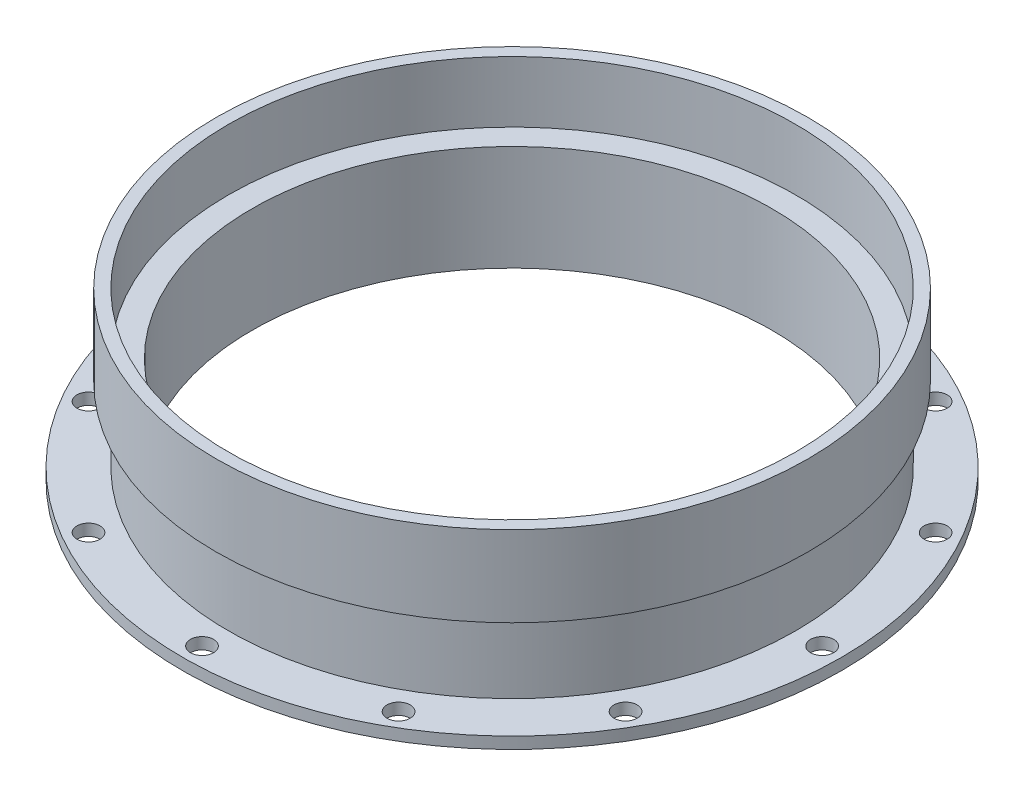
ISO-10303-21;
HEADER;
FILE_DESCRIPTION(('STEP AP214'),'2;1');
FILE_NAME('part.step','',(''),(''),'','','');
FILE_SCHEMA(('AUTOMOTIVE_DESIGN { 1 0 10303 214 1 1 1 1 }'));
ENDSEC;
DATA;
#1=APPLICATION_CONTEXT('core data for automotive mechanical design processes');
#2=APPLICATION_PROTOCOL_DEFINITION('international standard','automotive_design',2000,#1);
#3=PRODUCT_CONTEXT('',#1,'mechanical');
#4=PRODUCT('Part','Part','',(#3));
#5=PRODUCT_RELATED_PRODUCT_CATEGORY('part','',(#4));
#6=PRODUCT_DEFINITION_FORMATION('','',#4);
#7=PRODUCT_DEFINITION_CONTEXT('part definition',#1,'design');
#8=PRODUCT_DEFINITION('design','',#6,#7);
#9=PRODUCT_DEFINITION_SHAPE('','',#8);
#10=(LENGTH_UNIT() NAMED_UNIT(*) SI_UNIT(.MILLI.,.METRE.));
#11=(NAMED_UNIT(*) PLANE_ANGLE_UNIT() SI_UNIT($,.RADIAN.));
#12=(NAMED_UNIT(*) SI_UNIT($,.STERADIAN.) SOLID_ANGLE_UNIT());
#13=UNCERTAINTY_MEASURE_WITH_UNIT(LENGTH_MEASURE(1.E-05),#10,'distance_accuracy_value','');
#14=(GEOMETRIC_REPRESENTATION_CONTEXT(3) GLOBAL_UNCERTAINTY_ASSIGNED_CONTEXT((#13)) GLOBAL_UNIT_ASSIGNED_CONTEXT((#10,
#11,#12)) REPRESENTATION_CONTEXT('',''));
#15=CARTESIAN_POINT('',(0.,0.,0.));
#16=DIRECTION('',(0.,0.,1.));
#17=DIRECTION('',(1.,0.,0.));
#18=AXIS2_PLACEMENT_3D('',#15,#16,#17);
#19=CARTESIAN_POINT('',(0.,17.8,0.));
#20=DIRECTION('',(0.,-1.,0.));
#21=DIRECTION('',(-1.,0.,0.));
#22=AXIS2_PLACEMENT_3D('',#19,#20,#21);
#23=CYLINDRICAL_SURFACE('',#22,53.85);
#24=CARTESIAN_POINT('',(0.,0.,0.));
#25=DIRECTION('',(0.,1.,0.));
#26=DIRECTION('',(1.,0.,0.));
#27=AXIS2_PLACEMENT_3D('',#24,#25,#26);
#28=CIRCLE('',#27,53.85);
#29=CARTESIAN_POINT('',(53.85,0.,0.));
#30=VERTEX_POINT('',#29);
#31=EDGE_CURVE('E10',#30,#30,#28,.T.);
#32=ORIENTED_EDGE('',*,*,#31,.T.);
#33=EDGE_LOOP('',(#32));
#34=FACE_BOUND('',#33,.T.);
#35=CARTESIAN_POINT('',(0.,14.1,0.));
#36=DIRECTION('',(0.,1.,0.));
#37=DIRECTION('',(1.,0.,0.));
#38=AXIS2_PLACEMENT_3D('',#35,#36,#37);
#39=CIRCLE('',#38,53.85);
#40=CARTESIAN_POINT('',(53.85,14.1,0.));
#41=VERTEX_POINT('',#40);
#42=EDGE_CURVE('E21',#41,#41,#39,.T.);
#43=ORIENTED_EDGE('',*,*,#42,.F.);
#44=EDGE_LOOP('',(#43));
#45=FACE_BOUND('',#44,.T.);
#46=ADVANCED_FACE('F15',(#34,#45),#23,.T.);
#47=CARTESIAN_POINT('',(0.,-2.2,0.));
#48=DIRECTION('',(0.,1.,0.));
#49=DIRECTION('',(1.,0.,0.));
#50=AXIS2_PLACEMENT_3D('',#47,#48,#49);
#51=CYLINDRICAL_SURFACE('',#50,62.55);
#52=CARTESIAN_POINT('',(0.,-2.2,0.));
#53=DIRECTION('',(0.,1.,0.));
#54=DIRECTION('',(1.,0.,0.));
#55=AXIS2_PLACEMENT_3D('',#52,#53,#54);
#56=CIRCLE('',#55,62.55);
#57=CARTESIAN_POINT('',(62.55,-2.2,0.));
#58=VERTEX_POINT('',#57);
#59=EDGE_CURVE('E25',#58,#58,#56,.T.);
#60=ORIENTED_EDGE('',*,*,#59,.T.);
#61=EDGE_LOOP('',(#60));
#62=FACE_BOUND('',#61,.T.);
#63=CARTESIAN_POINT('',(0.,0.,0.));
#64=DIRECTION('',(0.,1.,0.));
#65=DIRECTION('',(1.,0.,0.));
#66=AXIS2_PLACEMENT_3D('',#63,#64,#65);
#67=CIRCLE('',#66,62.55);
#68=CARTESIAN_POINT('',(62.55,0.,0.));
#69=VERTEX_POINT('',#68);
#70=EDGE_CURVE('E29',#69,#69,#67,.T.);
#71=ORIENTED_EDGE('',*,*,#70,.F.);
#72=EDGE_LOOP('',(#71));
#73=FACE_BOUND('',#72,.T.);
#74=ADVANCED_FACE('F143',(#62,#73),#51,.T.);
#75=CARTESIAN_POINT('',(0.,-2.2,0.));
#76=DIRECTION('',(0.,1.,0.));
#77=DIRECTION('',(1.,0.,0.));
#78=AXIS2_PLACEMENT_3D('',#75,#76,#77);
#79=CYLINDRICAL_SURFACE('',#78,49.35);
#80=CARTESIAN_POINT('',(0.,-2.2,0.));
#81=DIRECTION('',(0.,1.,0.));
#82=DIRECTION('',(1.,0.,0.));
#83=AXIS2_PLACEMENT_3D('',#80,#81,#82);
#84=CIRCLE('',#83,49.35);
#85=CARTESIAN_POINT('',(49.35,-2.2,0.));
#86=VERTEX_POINT('',#85);
#87=EDGE_CURVE('E34',#86,#86,#84,.T.);
#88=ORIENTED_EDGE('',*,*,#87,.F.);
#89=EDGE_LOOP('',(#88));
#90=FACE_BOUND('',#89,.T.);
#91=CARTESIAN_POINT('',(0.,17.8,0.));
#92=DIRECTION('',(0.,1.,0.));
#93=DIRECTION('',(1.,0.,0.));
#94=AXIS2_PLACEMENT_3D('',#91,#92,#93);
#95=CIRCLE('',#94,49.35);
#96=CARTESIAN_POINT('',(49.35,17.8,0.));
#97=VERTEX_POINT('',#96);
#98=EDGE_CURVE('E37',#97,#97,#95,.T.);
#99=ORIENTED_EDGE('',*,*,#98,.T.);
#100=EDGE_LOOP('',(#99));
#101=FACE_BOUND('',#100,.T.);
#102=ADVANCED_FACE('F147',(#90,#101),#79,.F.);
#103=CARTESIAN_POINT('',(0.,-2.2,0.));
#104=DIRECTION('',(0.,1.,0.));
#105=DIRECTION('',(1.,0.,0.));
#106=AXIS2_PLACEMENT_3D('',#103,#104,#105);
#107=PLANE('',#106);
#108=CARTESIAN_POINT('',(29.425,-2.2,-50.9655950127142));
#109=DIRECTION('',(0.,-1.,0.));
#110=DIRECTION('',(-1.,0.,0.));
#111=AXIS2_PLACEMENT_3D('',#108,#109,#110);
#112=CIRCLE('',#111,2.2);
#113=CARTESIAN_POINT('',(27.225,-2.2,-50.9655950127142));
#114=VERTEX_POINT('',#113);
#115=EDGE_CURVE('E40',#114,#114,#112,.T.);
#116=ORIENTED_EDGE('',*,*,#115,.F.);
#117=EDGE_LOOP('',(#116));
#118=FACE_BOUND('',#117,.T.);
#119=CARTESIAN_POINT('',(0.,-2.2,-58.85));
#120=DIRECTION('',(0.,-1.,0.));
#121=DIRECTION('',(-1.,0.,0.));
#122=AXIS2_PLACEMENT_3D('',#119,#120,#121);
#123=CIRCLE('',#122,2.2);
#124=CARTESIAN_POINT('',(-2.2,-2.2,-58.85));
#125=VERTEX_POINT('',#124);
#126=EDGE_CURVE('E43',#125,#125,#123,.T.);
#127=ORIENTED_EDGE('',*,*,#126,.F.);
#128=EDGE_LOOP('',(#127));
#129=FACE_BOUND('',#128,.T.);
#130=CARTESIAN_POINT('',(-29.425,-2.2,-50.9655950127142));
#131=DIRECTION('',(0.,-1.,0.));
#132=DIRECTION('',(-1.,0.,0.));
#133=AXIS2_PLACEMENT_3D('',#130,#131,#132);
#134=CIRCLE('',#133,2.2);
#135=CARTESIAN_POINT('',(-31.625,-2.2,-50.9655950127142));
#136=VERTEX_POINT('',#135);
#137=EDGE_CURVE('E46',#136,#136,#134,.T.);
#138=ORIENTED_EDGE('',*,*,#137,.F.);
#139=EDGE_LOOP('',(#138));
#140=FACE_BOUND('',#139,.T.);
#141=CARTESIAN_POINT('',(-50.9655950127142,-2.2,-29.425));
#142=DIRECTION('',(0.,-1.,0.));
#143=DIRECTION('',(-1.,0.,0.));
#144=AXIS2_PLACEMENT_3D('',#141,#142,#143);
#145=CIRCLE('',#144,2.2);
#146=CARTESIAN_POINT('',(-53.1655950127142,-2.2,-29.425));
#147=VERTEX_POINT('',#146);
#148=EDGE_CURVE('E49',#147,#147,#145,.T.);
#149=ORIENTED_EDGE('',*,*,#148,.F.);
#150=EDGE_LOOP('',(#149));
#151=FACE_BOUND('',#150,.T.);
#152=CARTESIAN_POINT('',(-58.85,-2.2,0.));
#153=DIRECTION('',(0.,-1.,0.));
#154=DIRECTION('',(-1.,0.,0.));
#155=AXIS2_PLACEMENT_3D('',#152,#153,#154);
#156=CIRCLE('',#155,2.2);
#157=CARTESIAN_POINT('',(-61.05,-2.2,0.));
#158=VERTEX_POINT('',#157);
#159=EDGE_CURVE('E52',#158,#158,#156,.T.);
#160=ORIENTED_EDGE('',*,*,#159,.F.);
#161=EDGE_LOOP('',(#160));
#162=FACE_BOUND('',#161,.T.);
#163=CARTESIAN_POINT('',(-50.9655950127142,-2.2,29.425));
#164=DIRECTION('',(0.,-1.,0.));
#165=DIRECTION('',(-1.,0.,0.));
#166=AXIS2_PLACEMENT_3D('',#163,#164,#165);
#167=CIRCLE('',#166,2.2);
#168=CARTESIAN_POINT('',(-53.1655950127142,-2.2,29.425));
#169=VERTEX_POINT('',#168);
#170=EDGE_CURVE('E55',#169,#169,#167,.T.);
#171=ORIENTED_EDGE('',*,*,#170,.F.);
#172=EDGE_LOOP('',(#171));
#173=FACE_BOUND('',#172,.T.);
#174=CARTESIAN_POINT('',(-29.425,-2.2,50.9655950127142));
#175=DIRECTION('',(0.,-1.,0.));
#176=DIRECTION('',(-1.,0.,0.));
#177=AXIS2_PLACEMENT_3D('',#174,#175,#176);
#178=CIRCLE('',#177,2.2);
#179=CARTESIAN_POINT('',(-31.625,-2.2,50.9655950127142));
#180=VERTEX_POINT('',#179);
#181=EDGE_CURVE('E58',#180,#180,#178,.T.);
#182=ORIENTED_EDGE('',*,*,#181,.F.);
#183=EDGE_LOOP('',(#182));
#184=FACE_BOUND('',#183,.T.);
#185=CARTESIAN_POINT('',(0.,-2.2,58.85));
#186=DIRECTION('',(0.,-1.,0.));
#187=DIRECTION('',(-1.,0.,0.));
#188=AXIS2_PLACEMENT_3D('',#185,#186,#187);
#189=CIRCLE('',#188,2.2);
#190=CARTESIAN_POINT('',(-2.20000000000001,-2.2,58.85));
#191=VERTEX_POINT('',#190);
#192=EDGE_CURVE('E61',#191,#191,#189,.T.);
#193=ORIENTED_EDGE('',*,*,#192,.F.);
#194=EDGE_LOOP('',(#193));
#195=FACE_BOUND('',#194,.T.);
#196=CARTESIAN_POINT('',(29.425,-2.2,50.9655950127142));
#197=DIRECTION('',(0.,-1.,0.));
#198=DIRECTION('',(-1.,0.,0.));
#199=AXIS2_PLACEMENT_3D('',#196,#197,#198);
#200=CIRCLE('',#199,2.2);
#201=CARTESIAN_POINT('',(27.225,-2.2,50.9655950127142));
#202=VERTEX_POINT('',#201);
#203=EDGE_CURVE('E64',#202,#202,#200,.T.);
#204=ORIENTED_EDGE('',*,*,#203,.F.);
#205=EDGE_LOOP('',(#204));
#206=FACE_BOUND('',#205,.T.);
#207=CARTESIAN_POINT('',(50.9655950127142,-2.2,29.425));
#208=DIRECTION('',(0.,-1.,0.));
#209=DIRECTION('',(-1.,0.,0.));
#210=AXIS2_PLACEMENT_3D('',#207,#208,#209);
#211=CIRCLE('',#210,2.2);
#212=CARTESIAN_POINT('',(48.7655950127142,-2.2,29.425));
#213=VERTEX_POINT('',#212);
#214=EDGE_CURVE('E67',#213,#213,#211,.T.);
#215=ORIENTED_EDGE('',*,*,#214,.F.);
#216=EDGE_LOOP('',(#215));
#217=FACE_BOUND('',#216,.T.);
#218=CARTESIAN_POINT('',(58.85,-2.2,0.));
#219=DIRECTION('',(0.,-1.,0.));
#220=DIRECTION('',(-1.,0.,0.));
#221=AXIS2_PLACEMENT_3D('',#218,#219,#220);
#222=CIRCLE('',#221,2.2);
#223=CARTESIAN_POINT('',(56.65,-2.2,0.));
#224=VERTEX_POINT('',#223);
#225=EDGE_CURVE('E70',#224,#224,#222,.T.);
#226=ORIENTED_EDGE('',*,*,#225,.F.);
#227=EDGE_LOOP('',(#226));
#228=FACE_BOUND('',#227,.T.);
#229=CARTESIAN_POINT('',(50.9655950127142,-2.2,-29.425));
#230=DIRECTION('',(0.,-1.,0.));
#231=DIRECTION('',(-1.,0.,0.));
#232=AXIS2_PLACEMENT_3D('',#229,#230,#231);
#233=CIRCLE('',#232,2.2);
#234=CARTESIAN_POINT('',(48.7655950127142,-2.2,-29.425));
#235=VERTEX_POINT('',#234);
#236=EDGE_CURVE('E73',#235,#235,#233,.T.);
#237=ORIENTED_EDGE('',*,*,#236,.F.);
#238=EDGE_LOOP('',(#237));
#239=FACE_BOUND('',#238,.T.);
#240=ORIENTED_EDGE('',*,*,#59,.F.);
#241=EDGE_LOOP('',(#240));
#242=FACE_BOUND('',#241,.T.);
#243=ORIENTED_EDGE('',*,*,#87,.T.);
#244=EDGE_LOOP('',(#243));
#245=FACE_BOUND('',#244,.T.);
#246=ADVANCED_FACE('F153',(#118,#129,#140,#151,#162,#173,#184,#195,#206,#217,#228,#239,#242,
#245),#107,.F.);
#247=CARTESIAN_POINT('',(0.,0.,0.));
#248=DIRECTION('',(0.,1.,0.));
#249=DIRECTION('',(1.,0.,0.));
#250=AXIS2_PLACEMENT_3D('',#247,#248,#249);
#251=PLANE('',#250);
#252=CARTESIAN_POINT('',(29.425,0.,-50.9655950127142));
#253=DIRECTION('',(0.,-1.,0.));
#254=DIRECTION('',(-1.,0.,0.));
#255=AXIS2_PLACEMENT_3D('',#252,#253,#254);
#256=CIRCLE('',#255,2.2);
#257=CARTESIAN_POINT('',(27.225,0.,-50.9655950127142));
#258=VERTEX_POINT('',#257);
#259=EDGE_CURVE('E76',#258,#258,#256,.T.);
#260=ORIENTED_EDGE('',*,*,#259,.T.);
#261=EDGE_LOOP('',(#260));
#262=FACE_BOUND('',#261,.T.);
#263=CARTESIAN_POINT('',(0.,0.,-58.85));
#264=DIRECTION('',(0.,-1.,0.));
#265=DIRECTION('',(-1.,0.,0.));
#266=AXIS2_PLACEMENT_3D('',#263,#264,#265);
#267=CIRCLE('',#266,2.2);
#268=CARTESIAN_POINT('',(-2.2,0.,-58.85));
#269=VERTEX_POINT('',#268);
#270=EDGE_CURVE('E79',#269,#269,#267,.T.);
#271=ORIENTED_EDGE('',*,*,#270,.T.);
#272=EDGE_LOOP('',(#271));
#273=FACE_BOUND('',#272,.T.);
#274=CARTESIAN_POINT('',(-29.425,0.,-50.9655950127142));
#275=DIRECTION('',(0.,-1.,0.));
#276=DIRECTION('',(-1.,0.,0.));
#277=AXIS2_PLACEMENT_3D('',#274,#275,#276);
#278=CIRCLE('',#277,2.2);
#279=CARTESIAN_POINT('',(-31.625,0.,-50.9655950127142));
#280=VERTEX_POINT('',#279);
#281=EDGE_CURVE('E82',#280,#280,#278,.T.);
#282=ORIENTED_EDGE('',*,*,#281,.T.);
#283=EDGE_LOOP('',(#282));
#284=FACE_BOUND('',#283,.T.);
#285=CARTESIAN_POINT('',(-50.9655950127142,0.,-29.425));
#286=DIRECTION('',(0.,-1.,0.));
#287=DIRECTION('',(-1.,0.,0.));
#288=AXIS2_PLACEMENT_3D('',#285,#286,#287);
#289=CIRCLE('',#288,2.2);
#290=CARTESIAN_POINT('',(-53.1655950127142,0.,-29.425));
#291=VERTEX_POINT('',#290);
#292=EDGE_CURVE('E85',#291,#291,#289,.T.);
#293=ORIENTED_EDGE('',*,*,#292,.T.);
#294=EDGE_LOOP('',(#293));
#295=FACE_BOUND('',#294,.T.);
#296=CARTESIAN_POINT('',(-58.85,0.,0.));
#297=DIRECTION('',(0.,-1.,0.));
#298=DIRECTION('',(-1.,0.,0.));
#299=AXIS2_PLACEMENT_3D('',#296,#297,#298);
#300=CIRCLE('',#299,2.2);
#301=CARTESIAN_POINT('',(-61.05,0.,0.));
#302=VERTEX_POINT('',#301);
#303=EDGE_CURVE('E88',#302,#302,#300,.T.);
#304=ORIENTED_EDGE('',*,*,#303,.T.);
#305=EDGE_LOOP('',(#304));
#306=FACE_BOUND('',#305,.T.);
#307=CARTESIAN_POINT('',(-50.9655950127142,0.,29.425));
#308=DIRECTION('',(0.,-1.,0.));
#309=DIRECTION('',(-1.,0.,0.));
#310=AXIS2_PLACEMENT_3D('',#307,#308,#309);
#311=CIRCLE('',#310,2.2);
#312=CARTESIAN_POINT('',(-53.1655950127142,0.,29.425));
#313=VERTEX_POINT('',#312);
#314=EDGE_CURVE('E91',#313,#313,#311,.T.);
#315=ORIENTED_EDGE('',*,*,#314,.T.);
#316=EDGE_LOOP('',(#315));
#317=FACE_BOUND('',#316,.T.);
#318=CARTESIAN_POINT('',(-29.425,0.,50.9655950127142));
#319=DIRECTION('',(0.,-1.,0.));
#320=DIRECTION('',(-1.,0.,0.));
#321=AXIS2_PLACEMENT_3D('',#318,#319,#320);
#322=CIRCLE('',#321,2.2);
#323=CARTESIAN_POINT('',(-31.625,0.,50.9655950127142));
#324=VERTEX_POINT('',#323);
#325=EDGE_CURVE('E94',#324,#324,#322,.T.);
#326=ORIENTED_EDGE('',*,*,#325,.T.);
#327=EDGE_LOOP('',(#326));
#328=FACE_BOUND('',#327,.T.);
#329=CARTESIAN_POINT('',(0.,0.,58.85));
#330=DIRECTION('',(0.,-1.,0.));
#331=DIRECTION('',(-1.,0.,0.));
#332=AXIS2_PLACEMENT_3D('',#329,#330,#331);
#333=CIRCLE('',#332,2.2);
#334=CARTESIAN_POINT('',(-2.20000000000001,0.,58.85));
#335=VERTEX_POINT('',#334);
#336=EDGE_CURVE('E97',#335,#335,#333,.T.);
#337=ORIENTED_EDGE('',*,*,#336,.T.);
#338=EDGE_LOOP('',(#337));
#339=FACE_BOUND('',#338,.T.);
#340=CARTESIAN_POINT('',(29.425,0.,50.9655950127142));
#341=DIRECTION('',(0.,-1.,0.));
#342=DIRECTION('',(-1.,0.,0.));
#343=AXIS2_PLACEMENT_3D('',#340,#341,#342);
#344=CIRCLE('',#343,2.2);
#345=CARTESIAN_POINT('',(27.225,0.,50.9655950127142));
#346=VERTEX_POINT('',#345);
#347=EDGE_CURVE('E100',#346,#346,#344,.T.);
#348=ORIENTED_EDGE('',*,*,#347,.T.);
#349=EDGE_LOOP('',(#348));
#350=FACE_BOUND('',#349,.T.);
#351=CARTESIAN_POINT('',(50.9655950127142,0.,29.425));
#352=DIRECTION('',(0.,-1.,0.));
#353=DIRECTION('',(-1.,0.,0.));
#354=AXIS2_PLACEMENT_3D('',#351,#352,#353);
#355=CIRCLE('',#354,2.2);
#356=CARTESIAN_POINT('',(48.7655950127142,0.,29.425));
#357=VERTEX_POINT('',#356);
#358=EDGE_CURVE('E103',#357,#357,#355,.T.);
#359=ORIENTED_EDGE('',*,*,#358,.T.);
#360=EDGE_LOOP('',(#359));
#361=FACE_BOUND('',#360,.T.);
#362=CARTESIAN_POINT('',(58.85,0.,0.));
#363=DIRECTION('',(0.,-1.,0.));
#364=DIRECTION('',(-1.,0.,0.));
#365=AXIS2_PLACEMENT_3D('',#362,#363,#364);
#366=CIRCLE('',#365,2.2);
#367=CARTESIAN_POINT('',(56.65,0.,0.));
#368=VERTEX_POINT('',#367);
#369=EDGE_CURVE('E106',#368,#368,#366,.T.);
#370=ORIENTED_EDGE('',*,*,#369,.T.);
#371=EDGE_LOOP('',(#370));
#372=FACE_BOUND('',#371,.T.);
#373=CARTESIAN_POINT('',(50.9655950127142,0.,-29.425));
#374=DIRECTION('',(0.,-1.,0.));
#375=DIRECTION('',(-1.,0.,0.));
#376=AXIS2_PLACEMENT_3D('',#373,#374,#375);
#377=CIRCLE('',#376,2.2);
#378=CARTESIAN_POINT('',(48.7655950127142,0.,-29.425));
#379=VERTEX_POINT('',#378);
#380=EDGE_CURVE('E109',#379,#379,#377,.T.);
#381=ORIENTED_EDGE('',*,*,#380,.T.);
#382=EDGE_LOOP('',(#381));
#383=FACE_BOUND('',#382,.T.);
#384=ORIENTED_EDGE('',*,*,#31,.F.);
#385=EDGE_LOOP('',(#384));
#386=FACE_BOUND('',#385,.T.);
#387=ORIENTED_EDGE('',*,*,#70,.T.);
#388=EDGE_LOOP('',(#387));
#389=FACE_BOUND('',#388,.T.);
#390=ADVANCED_FACE('F160',(#262,#273,#284,#295,#306,#317,#328,#339,#350,#361,#372,#383,#386,
#389),#251,.T.);
#391=CARTESIAN_POINT('',(0.,17.8,0.));
#392=DIRECTION('',(0.,1.,0.));
#393=DIRECTION('',(1.,0.,0.));
#394=AXIS2_PLACEMENT_3D('',#391,#392,#393);
#395=PLANE('',#394);
#396=ORIENTED_EDGE('',*,*,#98,.F.);
#397=EDGE_LOOP('',(#396));
#398=FACE_BOUND('',#397,.T.);
#399=CARTESIAN_POINT('',(0.,17.8,0.));
#400=DIRECTION('',(0.,1.,0.));
#401=DIRECTION('',(1.,0.,0.));
#402=AXIS2_PLACEMENT_3D('',#399,#400,#401);
#403=CIRCLE('',#402,53.85);
#404=CARTESIAN_POINT('',(53.85,17.8,0.));
#405=VERTEX_POINT('',#404);
#406=EDGE_CURVE('E112',#405,#405,#403,.F.);
#407=ORIENTED_EDGE('',*,*,#406,.F.);
#408=EDGE_LOOP('',(#407));
#409=FACE_BOUND('',#408,.T.);
#410=ADVANCED_FACE('F164',(#398,#409),#395,.T.);
#411=CARTESIAN_POINT('',(0.,29.4,0.));
#412=DIRECTION('',(0.,-1.,0.));
#413=DIRECTION('',(-1.,0.,0.));
#414=AXIS2_PLACEMENT_3D('',#411,#412,#413);
#415=CYLINDRICAL_SURFACE('',#414,53.85);
#416=ORIENTED_EDGE('',*,*,#406,.T.);
#417=EDGE_LOOP('',(#416));
#418=FACE_BOUND('',#417,.T.);
#419=CARTESIAN_POINT('',(0.,29.4,0.));
#420=DIRECTION('',(0.,1.,0.));
#421=DIRECTION('',(1.,0.,0.));
#422=AXIS2_PLACEMENT_3D('',#419,#420,#421);
#423=CIRCLE('',#422,53.85);
#424=CARTESIAN_POINT('',(53.85,29.4,0.));
#425=VERTEX_POINT('',#424);
#426=EDGE_CURVE('E115',#425,#425,#423,.T.);
#427=ORIENTED_EDGE('',*,*,#426,.T.);
#428=EDGE_LOOP('',(#427));
#429=FACE_BOUND('',#428,.T.);
#430=ADVANCED_FACE('F168',(#418,#429),#415,.F.);
#431=CARTESIAN_POINT('',(0.,29.4,0.));
#432=DIRECTION('',(0.,-1.,0.));
#433=DIRECTION('',(-1.,0.,0.));
#434=AXIS2_PLACEMENT_3D('',#431,#432,#433);
#435=CYLINDRICAL_SURFACE('',#434,56.15);
#436=CARTESIAN_POINT('',(0.,29.4,0.));
#437=DIRECTION('',(0.,1.,0.));
#438=DIRECTION('',(1.,0.,0.));
#439=AXIS2_PLACEMENT_3D('',#436,#437,#438);
#440=CIRCLE('',#439,56.15);
#441=CARTESIAN_POINT('',(56.15,29.4,0.));
#442=VERTEX_POINT('',#441);
#443=EDGE_CURVE('E118',#442,#442,#440,.T.);
#444=ORIENTED_EDGE('',*,*,#443,.F.);
#445=EDGE_LOOP('',(#444));
#446=FACE_BOUND('',#445,.T.);
#447=CARTESIAN_POINT('',(0.,14.1,0.));
#448=DIRECTION('',(0.,1.,0.));
#449=DIRECTION('',(1.,0.,0.));
#450=AXIS2_PLACEMENT_3D('',#447,#448,#449);
#451=CIRCLE('',#450,56.15);
#452=CARTESIAN_POINT('',(56.15,14.1,0.));
#453=VERTEX_POINT('',#452);
#454=EDGE_CURVE('E121',#453,#453,#451,.T.);
#455=ORIENTED_EDGE('',*,*,#454,.T.);
#456=EDGE_LOOP('',(#455));
#457=FACE_BOUND('',#456,.T.);
#458=ADVANCED_FACE('F125',(#446,#457),#435,.T.);
#459=CARTESIAN_POINT('',(0.,29.4,0.));
#460=DIRECTION('',(0.,1.,0.));
#461=DIRECTION('',(1.,0.,0.));
#462=AXIS2_PLACEMENT_3D('',#459,#460,#461);
#463=PLANE('',#462);
#464=ORIENTED_EDGE('',*,*,#426,.F.);
#465=EDGE_LOOP('',(#464));
#466=FACE_BOUND('',#465,.T.);
#467=ORIENTED_EDGE('',*,*,#443,.T.);
#468=EDGE_LOOP('',(#467));
#469=FACE_BOUND('',#468,.T.);
#470=ADVANCED_FACE('F130',(#466,#469),#463,.T.);
#471=CARTESIAN_POINT('',(0.,14.1,0.));
#472=DIRECTION('',(0.,1.,0.));
#473=DIRECTION('',(1.,0.,0.));
#474=AXIS2_PLACEMENT_3D('',#471,#472,#473);
#475=PLANE('',#474);
#476=ORIENTED_EDGE('',*,*,#42,.T.);
#477=EDGE_LOOP('',(#476));
#478=FACE_BOUND('',#477,.T.);
#479=ORIENTED_EDGE('',*,*,#454,.F.);
#480=EDGE_LOOP('',(#479));
#481=FACE_BOUND('',#480,.T.);
#482=ADVANCED_FACE('F127',(#478,#481),#475,.F.);
#483=CARTESIAN_POINT('',(50.9655950127142,0.,-29.425));
#484=DIRECTION('',(0.,-1.,0.));
#485=DIRECTION('',(-1.,0.,0.));
#486=AXIS2_PLACEMENT_3D('',#483,#484,#485);
#487=CYLINDRICAL_SURFACE('',#486,2.2);
#488=ORIENTED_EDGE('',*,*,#380,.F.);
#489=EDGE_LOOP('',(#488));
#490=FACE_BOUND('',#489,.T.);
#491=ORIENTED_EDGE('',*,*,#236,.T.);
#492=EDGE_LOOP('',(#491));
#493=FACE_BOUND('',#492,.T.);
#494=ADVANCED_FACE('F129',(#490,#493),#487,.F.);
#495=CARTESIAN_POINT('',(58.85,0.,0.));
#496=DIRECTION('',(0.,-1.,0.));
#497=DIRECTION('',(-1.,0.,0.));
#498=AXIS2_PLACEMENT_3D('',#495,#496,#497);
#499=CYLINDRICAL_SURFACE('',#498,2.2);
#500=ORIENTED_EDGE('',*,*,#369,.F.);
#501=EDGE_LOOP('',(#500));
#502=FACE_BOUND('',#501,.T.);
#503=ORIENTED_EDGE('',*,*,#225,.T.);
#504=EDGE_LOOP('',(#503));
#505=FACE_BOUND('',#504,.T.);
#506=ADVANCED_FACE('F137',(#502,#505),#499,.F.);
#507=CARTESIAN_POINT('',(50.9655950127142,0.,29.425));
#508=DIRECTION('',(0.,-1.,0.));
#509=DIRECTION('',(-1.,0.,0.));
#510=AXIS2_PLACEMENT_3D('',#507,#508,#509);
#511=CYLINDRICAL_SURFACE('',#510,2.2);
#512=ORIENTED_EDGE('',*,*,#358,.F.);
#513=EDGE_LOOP('',(#512));
#514=FACE_BOUND('',#513,.T.);
#515=ORIENTED_EDGE('',*,*,#214,.T.);
#516=EDGE_LOOP('',(#515));
#517=FACE_BOUND('',#516,.T.);
#518=ADVANCED_FACE('F203',(#514,#517),#511,.F.);
#519=CARTESIAN_POINT('',(29.425,0.,50.9655950127142));
#520=DIRECTION('',(0.,-1.,0.));
#521=DIRECTION('',(-1.,0.,0.));
#522=AXIS2_PLACEMENT_3D('',#519,#520,#521);
#523=CYLINDRICAL_SURFACE('',#522,2.2);
#524=ORIENTED_EDGE('',*,*,#347,.F.);
#525=EDGE_LOOP('',(#524));
#526=FACE_BOUND('',#525,.T.);
#527=ORIENTED_EDGE('',*,*,#203,.T.);
#528=EDGE_LOOP('',(#527));
#529=FACE_BOUND('',#528,.T.);
#530=ADVANCED_FACE('F211',(#526,#529),#523,.F.);
#531=CARTESIAN_POINT('',(0.,0.,58.85));
#532=DIRECTION('',(0.,-1.,0.));
#533=DIRECTION('',(-1.,0.,0.));
#534=AXIS2_PLACEMENT_3D('',#531,#532,#533);
#535=CYLINDRICAL_SURFACE('',#534,2.2);
#536=ORIENTED_EDGE('',*,*,#336,.F.);
#537=EDGE_LOOP('',(#536));
#538=FACE_BOUND('',#537,.T.);
#539=ORIENTED_EDGE('',*,*,#192,.T.);
#540=EDGE_LOOP('',(#539));
#541=FACE_BOUND('',#540,.T.);
#542=ADVANCED_FACE('F219',(#538,#541),#535,.F.);
#543=CARTESIAN_POINT('',(-29.425,0.,50.9655950127142));
#544=DIRECTION('',(0.,-1.,0.));
#545=DIRECTION('',(-1.,0.,0.));
#546=AXIS2_PLACEMENT_3D('',#543,#544,#545);
#547=CYLINDRICAL_SURFACE('',#546,2.2);
#548=ORIENTED_EDGE('',*,*,#325,.F.);
#549=EDGE_LOOP('',(#548));
#550=FACE_BOUND('',#549,.T.);
#551=ORIENTED_EDGE('',*,*,#181,.T.);
#552=EDGE_LOOP('',(#551));
#553=FACE_BOUND('',#552,.T.);
#554=ADVANCED_FACE('F227',(#550,#553),#547,.F.);
#555=CARTESIAN_POINT('',(-50.9655950127142,0.,29.425));
#556=DIRECTION('',(0.,-1.,0.));
#557=DIRECTION('',(-1.,0.,0.));
#558=AXIS2_PLACEMENT_3D('',#555,#556,#557);
#559=CYLINDRICAL_SURFACE('',#558,2.2);
#560=ORIENTED_EDGE('',*,*,#314,.F.);
#561=EDGE_LOOP('',(#560));
#562=FACE_BOUND('',#561,.T.);
#563=ORIENTED_EDGE('',*,*,#170,.T.);
#564=EDGE_LOOP('',(#563));
#565=FACE_BOUND('',#564,.T.);
#566=ADVANCED_FACE('F235',(#562,#565),#559,.F.);
#567=CARTESIAN_POINT('',(-58.85,0.,0.));
#568=DIRECTION('',(0.,-1.,0.));
#569=DIRECTION('',(-1.,0.,0.));
#570=AXIS2_PLACEMENT_3D('',#567,#568,#569);
#571=CYLINDRICAL_SURFACE('',#570,2.2);
#572=ORIENTED_EDGE('',*,*,#303,.F.);
#573=EDGE_LOOP('',(#572));
#574=FACE_BOUND('',#573,.T.);
#575=ORIENTED_EDGE('',*,*,#159,.T.);
#576=EDGE_LOOP('',(#575));
#577=FACE_BOUND('',#576,.T.);
#578=ADVANCED_FACE('F243',(#574,#577),#571,.F.);
#579=CARTESIAN_POINT('',(-50.9655950127142,0.,-29.425));
#580=DIRECTION('',(0.,-1.,0.));
#581=DIRECTION('',(-1.,0.,0.));
#582=AXIS2_PLACEMENT_3D('',#579,#580,#581);
#583=CYLINDRICAL_SURFACE('',#582,2.2);
#584=ORIENTED_EDGE('',*,*,#292,.F.);
#585=EDGE_LOOP('',(#584));
#586=FACE_BOUND('',#585,.T.);
#587=ORIENTED_EDGE('',*,*,#148,.T.);
#588=EDGE_LOOP('',(#587));
#589=FACE_BOUND('',#588,.T.);
#590=ADVANCED_FACE('F251',(#586,#589),#583,.F.);
#591=CARTESIAN_POINT('',(-29.425,0.,-50.9655950127142));
#592=DIRECTION('',(0.,-1.,0.));
#593=DIRECTION('',(-1.,0.,0.));
#594=AXIS2_PLACEMENT_3D('',#591,#592,#593);
#595=CYLINDRICAL_SURFACE('',#594,2.2);
#596=ORIENTED_EDGE('',*,*,#281,.F.);
#597=EDGE_LOOP('',(#596));
#598=FACE_BOUND('',#597,.T.);
#599=ORIENTED_EDGE('',*,*,#137,.T.);
#600=EDGE_LOOP('',(#599));
#601=FACE_BOUND('',#600,.T.);
#602=ADVANCED_FACE('F259',(#598,#601),#595,.F.);
#603=CARTESIAN_POINT('',(0.,0.,-58.85));
#604=DIRECTION('',(0.,-1.,0.));
#605=DIRECTION('',(-1.,0.,0.));
#606=AXIS2_PLACEMENT_3D('',#603,#604,#605);
#607=CYLINDRICAL_SURFACE('',#606,2.2);
#608=ORIENTED_EDGE('',*,*,#270,.F.);
#609=EDGE_LOOP('',(#608));
#610=FACE_BOUND('',#609,.T.);
#611=ORIENTED_EDGE('',*,*,#126,.T.);
#612=EDGE_LOOP('',(#611));
#613=FACE_BOUND('',#612,.T.);
#614=ADVANCED_FACE('F267',(#610,#613),#607,.F.);
#615=CARTESIAN_POINT('',(29.425,0.,-50.9655950127142));
#616=DIRECTION('',(0.,-1.,0.));
#617=DIRECTION('',(-1.,0.,0.));
#618=AXIS2_PLACEMENT_3D('',#615,#616,#617);
#619=CYLINDRICAL_SURFACE('',#618,2.2);
#620=ORIENTED_EDGE('',*,*,#259,.F.);
#621=EDGE_LOOP('',(#620));
#622=FACE_BOUND('',#621,.T.);
#623=ORIENTED_EDGE('',*,*,#115,.T.);
#624=EDGE_LOOP('',(#623));
#625=FACE_BOUND('',#624,.T.);
#626=ADVANCED_FACE('F275',(#622,#625),#619,.F.);
#627=CLOSED_SHELL('',(#46,#74,#102,#246,#390,#410,#430,#458,#470,#482,#494,#506,#518,#530,#542,
#554,#566,#578,#590,#602,#614,#626));
#628=MANIFOLD_SOLID_BREP('B1',#627);
#629=ADVANCED_BREP_SHAPE_REPRESENTATION('',(#18,#628),#14);
#630=SHAPE_DEFINITION_REPRESENTATION(#9,#629);
ENDSEC;
END-ISO-10303-21;
